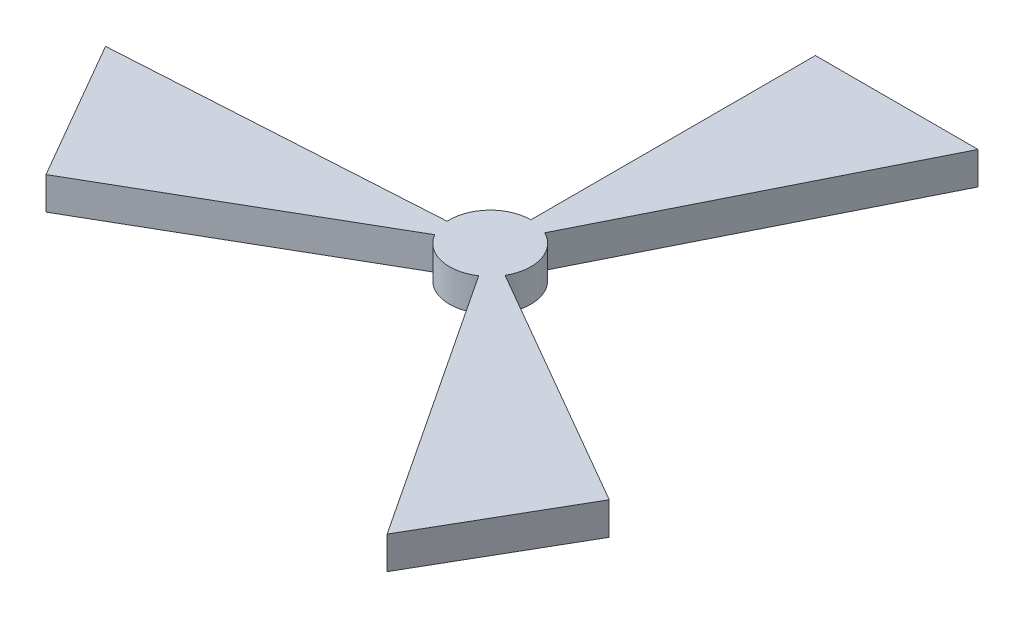
ISO-10303-21;
HEADER;
FILE_DESCRIPTION(('STEP AP214'),'2;1');
FILE_NAME('part.step','',(''),(''),'','','');
FILE_SCHEMA(('AUTOMOTIVE_DESIGN { 1 0 10303 214 1 1 1 1 }'));
ENDSEC;
DATA;
#1=APPLICATION_CONTEXT('core data for automotive mechanical design processes');
#2=APPLICATION_PROTOCOL_DEFINITION('international standard','automotive_design',2000,#1);
#3=PRODUCT_CONTEXT('',#1,'mechanical');
#4=PRODUCT('Part','Part','',(#3));
#5=PRODUCT_RELATED_PRODUCT_CATEGORY('part','',(#4));
#6=PRODUCT_DEFINITION_FORMATION('','',#4);
#7=PRODUCT_DEFINITION_CONTEXT('part definition',#1,'design');
#8=PRODUCT_DEFINITION('design','',#6,#7);
#9=PRODUCT_DEFINITION_SHAPE('','',#8);
#10=(LENGTH_UNIT() NAMED_UNIT(*) SI_UNIT(.MILLI.,.METRE.));
#11=(NAMED_UNIT(*) PLANE_ANGLE_UNIT() SI_UNIT($,.RADIAN.));
#12=(NAMED_UNIT(*) SI_UNIT($,.STERADIAN.) SOLID_ANGLE_UNIT());
#13=UNCERTAINTY_MEASURE_WITH_UNIT(LENGTH_MEASURE(1.E-05),#10,'distance_accuracy_value','');
#14=(GEOMETRIC_REPRESENTATION_CONTEXT(3) GLOBAL_UNCERTAINTY_ASSIGNED_CONTEXT((#13)) GLOBAL_UNIT_ASSIGNED_CONTEXT((#10,
#11,#12)) REPRESENTATION_CONTEXT('',''));
#15=CARTESIAN_POINT('',(0.,0.,0.));
#16=DIRECTION('',(0.,0.,1.));
#17=DIRECTION('',(1.,0.,0.));
#18=AXIS2_PLACEMENT_3D('',#15,#16,#17);
#19=CARTESIAN_POINT('',(0.,10.,0.));
#20=DIRECTION('',(0.500000000000004,0.,0.866025403784436));
#21=DIRECTION('',(0.866025403784436,0.,-0.500000000000004));
#22=AXIS2_PLACEMENT_3D('',#19,#20,#21);
#23=PLANE('',#22);
#24=DIRECTION('',(-0.866025403784436,0.,0.500000000000004));
#25=VECTOR('',#24,1.);
#26=CARTESIAN_POINT('',(0.,0.,0.));
#27=LINE('',#26,#25);
#28=CARTESIAN_POINT('',(-10.8253175473055,0.,6.25000000000005));
#29=VERTEX_POINT('',#28);
#30=CARTESIAN_POINT('',(-86.6025403784436,0.,50.0000000000004));
#31=VERTEX_POINT('',#30);
#32=EDGE_CURVE('E155',#29,#31,#27,.T.);
#33=ORIENTED_EDGE('',*,*,#32,.F.);
#34=DIRECTION('',(0.,-1.,0.));
#35=VECTOR('',#34,1.);
#36=CARTESIAN_POINT('',(-10.8253175473055,10.,6.25000000000005));
#37=LINE('',#36,#35);
#38=CARTESIAN_POINT('',(-10.8253175473055,10.,6.25000000000005));
#39=VERTEX_POINT('',#38);
#40=EDGE_CURVE('E11',#39,#29,#37,.T.);
#41=ORIENTED_EDGE('',*,*,#40,.F.);
#42=DIRECTION('',(-0.866025403784436,0.,0.500000000000004));
#43=VECTOR('',#42,1.);
#44=CARTESIAN_POINT('',(0.,10.,0.));
#45=LINE('',#44,#43);
#46=CARTESIAN_POINT('',(-86.6025403784436,10.,50.0000000000004));
#47=VERTEX_POINT('',#46);
#48=EDGE_CURVE('E187',#39,#47,#45,.T.);
#49=ORIENTED_EDGE('',*,*,#48,.T.);
#50=DIRECTION('',(0.,-1.,0.));
#51=VECTOR('',#50,1.);
#52=CARTESIAN_POINT('',(-86.6025403784436,10.,50.0000000000004));
#53=LINE('',#52,#51);
#54=EDGE_CURVE('E53',#47,#31,#53,.T.);
#55=ORIENTED_EDGE('',*,*,#54,.T.);
#56=EDGE_LOOP('',(#33,#41,#49,#55));
#57=FACE_BOUND('',#56,.T.);
#58=ADVANCED_FACE('F37',(#57),#23,.T.);
#59=CARTESIAN_POINT('',(0.,10.,0.));
#60=DIRECTION('',(0.,-1.,0.));
#61=DIRECTION('',(0.,0.,-1.));
#62=AXIS2_PLACEMENT_3D('',#59,#60,#61);
#63=CYLINDRICAL_SURFACE('',#62,12.5);
#64=CARTESIAN_POINT('',(0.,0.,0.));
#65=DIRECTION('',(0.,1.,0.));
#66=DIRECTION('',(0.,0.,1.));
#67=AXIS2_PLACEMENT_3D('',#64,#65,#66);
#68=CIRCLE('',#67,12.5);
#69=CARTESIAN_POINT('',(6.88737339364376,0.,10.4313991265088));
#70=VERTEX_POINT('',#69);
#71=EDGE_CURVE('E157',#29,#70,#68,.T.);
#72=ORIENTED_EDGE('',*,*,#71,.T.);
#73=DIRECTION('',(0.,-1.,0.));
#74=VECTOR('',#73,1.);
#75=CARTESIAN_POINT('',(6.88737339364376,10.,10.4313991265088));
#76=LINE('',#75,#74);
#77=CARTESIAN_POINT('',(6.88737339364376,10.,10.4313991265088));
#78=VERTEX_POINT('',#77);
#79=EDGE_CURVE('E45',#78,#70,#76,.T.);
#80=ORIENTED_EDGE('',*,*,#79,.F.);
#81=CARTESIAN_POINT('',(0.,10.,0.));
#82=DIRECTION('',(0.,1.,0.));
#83=DIRECTION('',(0.,0.,1.));
#84=AXIS2_PLACEMENT_3D('',#81,#82,#83);
#85=CIRCLE('',#84,12.5);
#86=EDGE_CURVE('E224',#39,#78,#85,.T.);
#87=ORIENTED_EDGE('',*,*,#86,.F.);
#88=ORIENTED_EDGE('',*,*,#40,.T.);
#89=EDGE_LOOP('',(#72,#80,#87,#88));
#90=FACE_BOUND('',#89,.T.);
#91=ADVANCED_FACE('F211',(#90),#63,.T.);
#92=CARTESIAN_POINT('',(0.,10.,0.));
#93=DIRECTION('',(-0.834511930120702,0.,0.550989871491501));
#94=DIRECTION('',(0.550989871491501,0.,0.834511930120702));
#95=AXIS2_PLACEMENT_3D('',#92,#93,#94);
#96=PLANE('',#95);
#97=DIRECTION('',(-0.550989871491501,0.,-0.834511930120702));
#98=VECTOR('',#97,1.);
#99=CARTESIAN_POINT('',(0.,0.,0.));
#100=LINE('',#99,#98);
#101=CARTESIAN_POINT('',(61.6025403784435,0.,93.3012701892223));
#102=VERTEX_POINT('',#101);
#103=EDGE_CURVE('E160',#102,#70,#100,.T.);
#104=ORIENTED_EDGE('',*,*,#103,.F.);
#105=DIRECTION('',(0.,-1.,0.));
#106=VECTOR('',#105,1.);
#107=CARTESIAN_POINT('',(61.6025403784435,10.,93.3012701892223));
#108=LINE('',#107,#106);
#109=CARTESIAN_POINT('',(61.6025403784435,10.,93.3012701892223));
#110=VERTEX_POINT('',#109);
#111=EDGE_CURVE('E201',#110,#102,#108,.T.);
#112=ORIENTED_EDGE('',*,*,#111,.F.);
#113=DIRECTION('',(-0.550989871491501,0.,-0.834511930120702));
#114=VECTOR('',#113,1.);
#115=CARTESIAN_POINT('',(0.,10.,0.));
#116=LINE('',#115,#114);
#117=EDGE_CURVE('E208',#110,#78,#116,.T.);
#118=ORIENTED_EDGE('',*,*,#117,.T.);
#119=ORIENTED_EDGE('',*,*,#79,.T.);
#120=EDGE_LOOP('',(#104,#112,#118,#119));
#121=FACE_BOUND('',#120,.T.);
#122=ADVANCED_FACE('F206',(#121),#96,.T.);
#123=CARTESIAN_POINT('',(86.6025403784437,10.,50.0000000000004));
#124=DIRECTION('',(0.866025403784437,0.,0.500000000000004));
#125=DIRECTION('',(0.500000000000004,0.,-0.866025403784437));
#126=AXIS2_PLACEMENT_3D('',#123,#124,#125);
#127=PLANE('',#126);
#128=DIRECTION('',(-0.500000000000004,0.,0.866025403784437));
#129=VECTOR('',#128,1.);
#130=CARTESIAN_POINT('',(86.6025403784437,0.,50.0000000000004));
#131=LINE('',#130,#129);
#132=CARTESIAN_POINT('',(86.6025403784437,0.,50.0000000000004));
#133=VERTEX_POINT('',#132);
#134=EDGE_CURVE('E163',#133,#102,#131,.T.);
#135=ORIENTED_EDGE('',*,*,#134,.F.);
#136=DIRECTION('',(0.,-1.,0.));
#137=VECTOR('',#136,1.);
#138=CARTESIAN_POINT('',(86.6025403784437,10.,50.0000000000004));
#139=LINE('',#138,#137);
#140=CARTESIAN_POINT('',(86.6025403784437,10.,50.0000000000004));
#141=VERTEX_POINT('',#140);
#142=EDGE_CURVE('E199',#141,#133,#139,.T.);
#143=ORIENTED_EDGE('',*,*,#142,.F.);
#144=DIRECTION('',(-0.500000000000004,0.,0.866025403784437));
#145=VECTOR('',#144,1.);
#146=CARTESIAN_POINT('',(86.6025403784437,10.,50.0000000000004));
#147=LINE('',#146,#145);
#148=EDGE_CURVE('E221',#141,#110,#147,.T.);
#149=ORIENTED_EDGE('',*,*,#148,.T.);
#150=ORIENTED_EDGE('',*,*,#111,.T.);
#151=EDGE_LOOP('',(#135,#143,#149,#150));
#152=FACE_BOUND('',#151,.T.);
#153=ADVANCED_FACE('F218',(#152),#127,.T.);
#154=CARTESIAN_POINT('',(0.,10.,0.));
#155=DIRECTION('',(0.500000000000004,0.,-0.866025403784436));
#156=DIRECTION('',(-0.866025403784436,0.,-0.500000000000004));
#157=AXIS2_PLACEMENT_3D('',#154,#155,#156);
#158=PLANE('',#157);
#159=DIRECTION('',(0.866025403784436,0.,0.500000000000004));
#160=VECTOR('',#159,1.);
#161=CARTESIAN_POINT('',(0.,0.,0.));
#162=LINE('',#161,#160);
#163=CARTESIAN_POINT('',(10.8253175473055,0.,6.25000000000005));
#164=VERTEX_POINT('',#163);
#165=EDGE_CURVE('E166',#164,#133,#162,.T.);
#166=ORIENTED_EDGE('',*,*,#165,.F.);
#167=DIRECTION('',(0.,-1.,0.));
#168=VECTOR('',#167,1.);
#169=CARTESIAN_POINT('',(10.8253175473055,10.,6.25000000000005));
#170=LINE('',#169,#168);
#171=CARTESIAN_POINT('',(10.8253175473055,10.,6.25000000000005));
#172=VERTEX_POINT('',#171);
#173=EDGE_CURVE('E197',#172,#164,#170,.T.);
#174=ORIENTED_EDGE('',*,*,#173,.F.);
#175=DIRECTION('',(0.866025403784436,0.,0.500000000000004));
#176=VECTOR('',#175,1.);
#177=CARTESIAN_POINT('',(0.,10.,0.));
#178=LINE('',#177,#176);
#179=EDGE_CURVE('E226',#172,#141,#178,.T.);
#180=ORIENTED_EDGE('',*,*,#179,.T.);
#181=ORIENTED_EDGE('',*,*,#142,.T.);
#182=EDGE_LOOP('',(#166,#174,#180,#181));
#183=FACE_BOUND('',#182,.T.);
#184=ADVANCED_FACE('F264',(#183),#158,.T.);
#185=CARTESIAN_POINT('',(0.,10.,0.));
#186=DIRECTION('',(0.,-1.,0.));
#187=DIRECTION('',(0.,0.,-1.));
#188=AXIS2_PLACEMENT_3D('',#185,#186,#187);
#189=CYLINDRICAL_SURFACE('',#188,12.5);
#190=CARTESIAN_POINT('',(0.,0.,0.));
#191=DIRECTION('',(0.,1.,0.));
#192=DIRECTION('',(0.,0.,1.));
#193=AXIS2_PLACEMENT_3D('',#190,#191,#192);
#194=CIRCLE('',#193,12.5);
#195=CARTESIAN_POINT('',(5.59016994374948,0.,-11.180339887499));
#196=VERTEX_POINT('',#195);
#197=EDGE_CURVE('E169',#164,#196,#194,.T.);
#198=ORIENTED_EDGE('',*,*,#197,.T.);
#199=DIRECTION('',(0.,-1.,0.));
#200=VECTOR('',#199,1.);
#201=CARTESIAN_POINT('',(5.59016994374948,10.,-11.180339887499));
#202=LINE('',#201,#200);
#203=CARTESIAN_POINT('',(5.59016994374948,10.,-11.180339887499));
#204=VERTEX_POINT('',#203);
#205=EDGE_CURVE('E195',#204,#196,#202,.T.);
#206=ORIENTED_EDGE('',*,*,#205,.F.);
#207=CARTESIAN_POINT('',(0.,10.,0.));
#208=DIRECTION('',(0.,1.,0.));
#209=DIRECTION('',(0.,0.,1.));
#210=AXIS2_PLACEMENT_3D('',#207,#208,#209);
#211=CIRCLE('',#210,12.5);
#212=EDGE_CURVE('E232',#172,#204,#211,.T.);
#213=ORIENTED_EDGE('',*,*,#212,.F.);
#214=ORIENTED_EDGE('',*,*,#173,.T.);
#215=EDGE_LOOP('',(#198,#206,#213,#214));
#216=FACE_BOUND('',#215,.T.);
#217=ADVANCED_FACE('F267',(#216),#189,.T.);
#218=CARTESIAN_POINT('',(0.,10.,0.));
#219=DIRECTION('',(0.894427190999916,0.,0.447213595499958));
#220=DIRECTION('',(0.447213595499958,0.,-0.894427190999916));
#221=AXIS2_PLACEMENT_3D('',#218,#219,#220);
#222=PLANE('',#221);
#223=DIRECTION('',(-0.447213595499958,0.,0.894427190999916));
#224=VECTOR('',#223,1.);
#225=CARTESIAN_POINT('',(0.,0.,0.));
#226=LINE('',#225,#224);
#227=CARTESIAN_POINT('',(50.,0.,-100.));
#228=VERTEX_POINT('',#227);
#229=EDGE_CURVE('E172',#228,#196,#226,.T.);
#230=ORIENTED_EDGE('',*,*,#229,.F.);
#231=DIRECTION('',(0.,-1.,0.));
#232=VECTOR('',#231,1.);
#233=CARTESIAN_POINT('',(50.,10.,-100.));
#234=LINE('',#233,#232);
#235=CARTESIAN_POINT('',(50.,10.,-100.));
#236=VERTEX_POINT('',#235);
#237=EDGE_CURVE('E193',#236,#228,#234,.T.);
#238=ORIENTED_EDGE('',*,*,#237,.F.);
#239=DIRECTION('',(-0.447213595499958,0.,0.894427190999916));
#240=VECTOR('',#239,1.);
#241=CARTESIAN_POINT('',(0.,10.,0.));
#242=LINE('',#241,#240);
#243=EDGE_CURVE('E234',#236,#204,#242,.T.);
#244=ORIENTED_EDGE('',*,*,#243,.T.);
#245=ORIENTED_EDGE('',*,*,#205,.T.);
#246=EDGE_LOOP('',(#230,#238,#244,#245));
#247=FACE_BOUND('',#246,.T.);
#248=ADVANCED_FACE('F271',(#247),#222,.T.);
#249=CARTESIAN_POINT('',(0.,10.,-100.));
#250=DIRECTION('',(0.,0.,-1.));
#251=DIRECTION('',(-1.,0.,0.));
#252=AXIS2_PLACEMENT_3D('',#249,#250,#251);
#253=PLANE('',#252);
#254=DIRECTION('',(1.,0.,0.));
#255=VECTOR('',#254,1.);
#256=CARTESIAN_POINT('',(0.,0.,-100.));
#257=LINE('',#256,#255);
#258=CARTESIAN_POINT('',(0.,0.,-100.));
#259=VERTEX_POINT('',#258);
#260=EDGE_CURVE('E175',#259,#228,#257,.T.);
#261=ORIENTED_EDGE('',*,*,#260,.F.);
#262=DIRECTION('',(0.,-1.,0.));
#263=VECTOR('',#262,1.);
#264=CARTESIAN_POINT('',(0.,10.,-100.));
#265=LINE('',#264,#263);
#266=CARTESIAN_POINT('',(0.,10.,-100.));
#267=VERTEX_POINT('',#266);
#268=EDGE_CURVE('E191',#267,#259,#265,.T.);
#269=ORIENTED_EDGE('',*,*,#268,.F.);
#270=DIRECTION('',(1.,0.,0.));
#271=VECTOR('',#270,1.);
#272=CARTESIAN_POINT('',(0.,10.,-100.));
#273=LINE('',#272,#271);
#274=EDGE_CURVE('E237',#267,#236,#273,.T.);
#275=ORIENTED_EDGE('',*,*,#274,.T.);
#276=ORIENTED_EDGE('',*,*,#237,.T.);
#277=EDGE_LOOP('',(#261,#269,#275,#276));
#278=FACE_BOUND('',#277,.T.);
#279=ADVANCED_FACE('F275',(#278),#253,.T.);
#280=CARTESIAN_POINT('',(0.,10.,0.));
#281=DIRECTION('',(-1.,0.,0.));
#282=DIRECTION('',(0.,0.,1.));
#283=AXIS2_PLACEMENT_3D('',#280,#281,#282);
#284=PLANE('',#283);
#285=DIRECTION('',(0.,0.,-1.));
#286=VECTOR('',#285,1.);
#287=CARTESIAN_POINT('',(0.,0.,0.));
#288=LINE('',#287,#286);
#289=CARTESIAN_POINT('',(0.,0.,-12.5));
#290=VERTEX_POINT('',#289);
#291=EDGE_CURVE('E178',#290,#259,#288,.T.);
#292=ORIENTED_EDGE('',*,*,#291,.F.);
#293=DIRECTION('',(0.,-1.,0.));
#294=VECTOR('',#293,1.);
#295=CARTESIAN_POINT('',(0.,10.,-12.5));
#296=LINE('',#295,#294);
#297=CARTESIAN_POINT('',(0.,10.,-12.5));
#298=VERTEX_POINT('',#297);
#299=EDGE_CURVE('E147',#298,#290,#296,.T.);
#300=ORIENTED_EDGE('',*,*,#299,.F.);
#301=DIRECTION('',(0.,0.,-1.));
#302=VECTOR('',#301,1.);
#303=CARTESIAN_POINT('',(0.,10.,0.));
#304=LINE('',#303,#302);
#305=EDGE_CURVE('E137',#298,#267,#304,.T.);
#306=ORIENTED_EDGE('',*,*,#305,.T.);
#307=ORIENTED_EDGE('',*,*,#268,.T.);
#308=EDGE_LOOP('',(#292,#300,#306,#307));
#309=FACE_BOUND('',#308,.T.);
#310=ADVANCED_FACE('F241',(#309),#284,.T.);
#311=CARTESIAN_POINT('',(0.,10.,0.));
#312=DIRECTION('',(0.,-1.,0.));
#313=DIRECTION('',(0.,0.,-1.));
#314=AXIS2_PLACEMENT_3D('',#311,#312,#313);
#315=CYLINDRICAL_SURFACE('',#314,12.5);
#316=CARTESIAN_POINT('',(0.,0.,0.));
#317=DIRECTION('',(0.,1.,0.));
#318=DIRECTION('',(0.,0.,1.));
#319=AXIS2_PLACEMENT_3D('',#316,#317,#318);
#320=CIRCLE('',#319,12.5);
#321=CARTESIAN_POINT('',(-12.4775433373933,0.,0.748940760990263));
#322=VERTEX_POINT('',#321);
#323=EDGE_CURVE('E144',#290,#322,#320,.T.);
#324=ORIENTED_EDGE('',*,*,#323,.T.);
#325=DIRECTION('',(0.,-1.,0.));
#326=VECTOR('',#325,1.);
#327=CARTESIAN_POINT('',(-12.4775433373933,10.,0.748940760990263));
#328=LINE('',#327,#326);
#329=CARTESIAN_POINT('',(-12.4775433373933,10.,0.748940760990263));
#330=VERTEX_POINT('',#329);
#331=EDGE_CURVE('E141',#330,#322,#328,.T.);
#332=ORIENTED_EDGE('',*,*,#331,.F.);
#333=CARTESIAN_POINT('',(0.,10.,0.));
#334=DIRECTION('',(0.,1.,0.));
#335=DIRECTION('',(0.,0.,1.));
#336=AXIS2_PLACEMENT_3D('',#333,#334,#335);
#337=CIRCLE('',#336,12.5);
#338=EDGE_CURVE('E128',#298,#330,#337,.T.);
#339=ORIENTED_EDGE('',*,*,#338,.F.);
#340=ORIENTED_EDGE('',*,*,#299,.T.);
#341=EDGE_LOOP('',(#324,#332,#339,#340));
#342=FACE_BOUND('',#341,.T.);
#343=ADVANCED_FACE('F142',(#342),#315,.T.);
#344=CARTESIAN_POINT('',(0.,10.,0.));
#345=DIRECTION('',(-0.0599152608792211,0.,-0.998203466991462));
#346=DIRECTION('',(-0.998203466991462,0.,0.0599152608792211));
#347=AXIS2_PLACEMENT_3D('',#344,#345,#346);
#348=PLANE('',#347);
#349=DIRECTION('',(0.998203466991462,0.,-0.0599152608792211));
#350=VECTOR('',#349,1.);
#351=CARTESIAN_POINT('',(0.,0.,0.));
#352=LINE('',#351,#350);
#353=CARTESIAN_POINT('',(-111.602540378444,0.,6.6987298107786));
#354=VERTEX_POINT('',#353);
#355=EDGE_CURVE('E182',#354,#322,#352,.T.);
#356=ORIENTED_EDGE('',*,*,#355,.F.);
#357=DIRECTION('',(0.,-1.,0.));
#358=VECTOR('',#357,1.);
#359=CARTESIAN_POINT('',(-111.602540378444,10.,6.6987298107786));
#360=LINE('',#359,#358);
#361=CARTESIAN_POINT('',(-111.602540378444,10.,6.6987298107786));
#362=VERTEX_POINT('',#361);
#363=EDGE_CURVE('E90',#362,#354,#360,.T.);
#364=ORIENTED_EDGE('',*,*,#363,.F.);
#365=DIRECTION('',(0.998203466991462,0.,-0.0599152608792211));
#366=VECTOR('',#365,1.);
#367=CARTESIAN_POINT('',(0.,10.,0.));
#368=LINE('',#367,#366);
#369=EDGE_CURVE('E134',#362,#330,#368,.T.);
#370=ORIENTED_EDGE('',*,*,#369,.T.);
#371=ORIENTED_EDGE('',*,*,#331,.T.);
#372=EDGE_LOOP('',(#356,#364,#370,#371));
#373=FACE_BOUND('',#372,.T.);
#374=ADVANCED_FACE('F149',(#373),#348,.T.);
#375=CARTESIAN_POINT('',(-86.6025403784436,10.,50.0000000000004));
#376=DIRECTION('',(-0.866025403784436,0.,0.500000000000004));
#377=DIRECTION('',(0.500000000000004,0.,0.866025403784436));
#378=AXIS2_PLACEMENT_3D('',#375,#376,#377);
#379=PLANE('',#378);
#380=DIRECTION('',(-0.500000000000004,0.,-0.866025403784436));
#381=VECTOR('',#380,1.);
#382=CARTESIAN_POINT('',(-86.6025403784436,0.,50.0000000000004));
#383=LINE('',#382,#381);
#384=EDGE_CURVE('E184',#31,#354,#383,.T.);
#385=ORIENTED_EDGE('',*,*,#384,.F.);
#386=ORIENTED_EDGE('',*,*,#54,.F.);
#387=DIRECTION('',(-0.500000000000004,0.,-0.866025403784436));
#388=VECTOR('',#387,1.);
#389=CARTESIAN_POINT('',(-86.6025403784436,10.,50.0000000000004));
#390=LINE('',#389,#388);
#391=EDGE_CURVE('E150',#47,#362,#390,.T.);
#392=ORIENTED_EDGE('',*,*,#391,.T.);
#393=ORIENTED_EDGE('',*,*,#363,.T.);
#394=EDGE_LOOP('',(#385,#386,#392,#393));
#395=FACE_BOUND('',#394,.T.);
#396=ADVANCED_FACE('F243',(#395),#379,.T.);
#397=CARTESIAN_POINT('',(0.,10.,0.));
#398=DIRECTION('',(0.,1.,0.));
#399=DIRECTION('',(0.,0.,1.));
#400=AXIS2_PLACEMENT_3D('',#397,#398,#399);
#401=PLANE('',#400);
#402=ORIENTED_EDGE('',*,*,#48,.F.);
#403=ORIENTED_EDGE('',*,*,#86,.T.);
#404=ORIENTED_EDGE('',*,*,#117,.F.);
#405=ORIENTED_EDGE('',*,*,#148,.F.);
#406=ORIENTED_EDGE('',*,*,#179,.F.);
#407=ORIENTED_EDGE('',*,*,#212,.T.);
#408=ORIENTED_EDGE('',*,*,#243,.F.);
#409=ORIENTED_EDGE('',*,*,#274,.F.);
#410=ORIENTED_EDGE('',*,*,#305,.F.);
#411=ORIENTED_EDGE('',*,*,#338,.T.);
#412=ORIENTED_EDGE('',*,*,#369,.F.);
#413=ORIENTED_EDGE('',*,*,#391,.F.);
#414=EDGE_LOOP('',(#402,#403,#404,#405,#406,#407,#408,#409,#410,#411,#412,#413));
#415=FACE_BOUND('',#414,.T.);
#416=ADVANCED_FACE('F131',(#415),#401,.T.);
#417=CARTESIAN_POINT('',(0.,0.,0.));
#418=DIRECTION('',(0.,1.,0.));
#419=DIRECTION('',(0.,0.,1.));
#420=AXIS2_PLACEMENT_3D('',#417,#418,#419);
#421=PLANE('',#420);
#422=ORIENTED_EDGE('',*,*,#32,.T.);
#423=ORIENTED_EDGE('',*,*,#384,.T.);
#424=ORIENTED_EDGE('',*,*,#355,.T.);
#425=ORIENTED_EDGE('',*,*,#323,.F.);
#426=ORIENTED_EDGE('',*,*,#291,.T.);
#427=ORIENTED_EDGE('',*,*,#260,.T.);
#428=ORIENTED_EDGE('',*,*,#229,.T.);
#429=ORIENTED_EDGE('',*,*,#197,.F.);
#430=ORIENTED_EDGE('',*,*,#165,.T.);
#431=ORIENTED_EDGE('',*,*,#134,.T.);
#432=ORIENTED_EDGE('',*,*,#103,.T.);
#433=ORIENTED_EDGE('',*,*,#71,.F.);
#434=EDGE_LOOP('',(#422,#423,#424,#425,#426,#427,#428,#429,#430,#431,#432,#433));
#435=FACE_BOUND('',#434,.T.);
#436=ADVANCED_FACE('F213',(#435),#421,.F.);
#437=CLOSED_SHELL('',(#58,#91,#122,#153,#184,#217,#248,#279,#310,#343,#374,#396,#416,#436));
#438=MANIFOLD_SOLID_BREP('B2',#437);
#439=ADVANCED_BREP_SHAPE_REPRESENTATION('',(#18,#438),#14);
#440=SHAPE_DEFINITION_REPRESENTATION(#9,#439);
ENDSEC;
END-ISO-10303-21;
